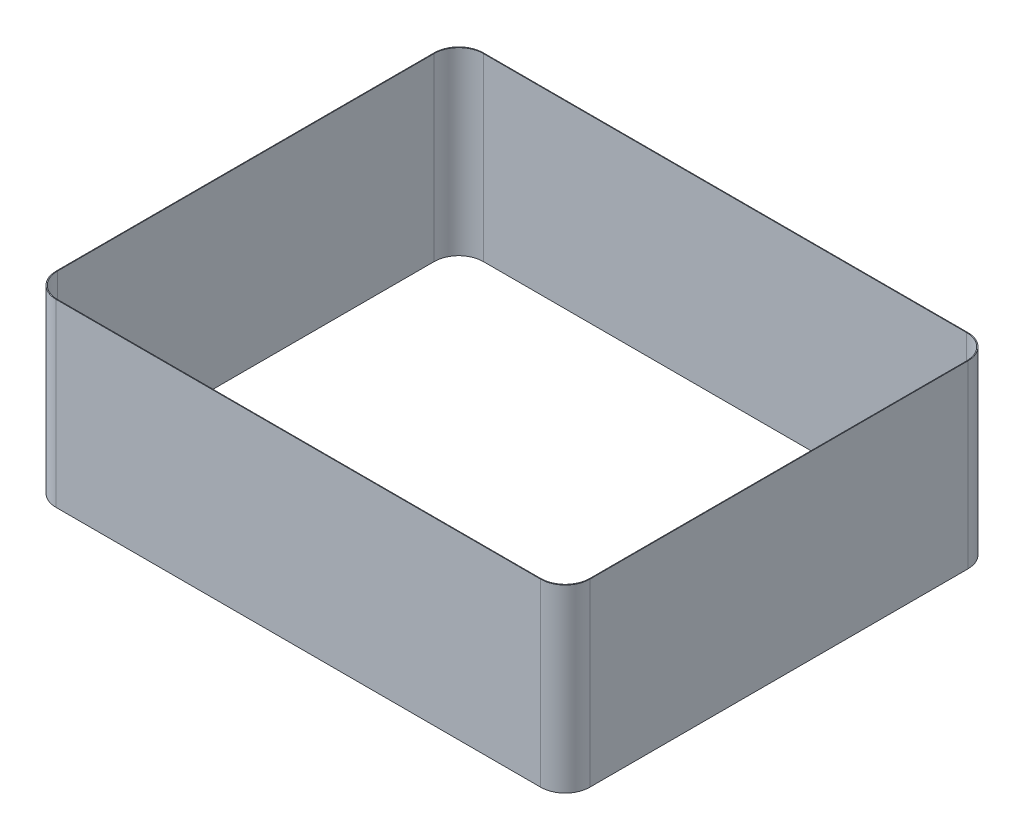
ISO-10303-21;
HEADER;
FILE_DESCRIPTION(('STEP AP214'),'2;1');
FILE_NAME('part.step','',(''),(''),'','','');
FILE_SCHEMA(('AUTOMOTIVE_DESIGN { 1 0 10303 214 1 1 1 1 }'));
ENDSEC;
DATA;
#1=APPLICATION_CONTEXT('core data for automotive mechanical design processes');
#2=APPLICATION_PROTOCOL_DEFINITION('international standard','automotive_design',2000,#1);
#3=PRODUCT_CONTEXT('',#1,'mechanical');
#4=PRODUCT('Part','Part','',(#3));
#5=PRODUCT_RELATED_PRODUCT_CATEGORY('part','',(#4));
#6=PRODUCT_DEFINITION_FORMATION('','',#4);
#7=PRODUCT_DEFINITION_CONTEXT('part definition',#1,'design');
#8=PRODUCT_DEFINITION('design','',#6,#7);
#9=PRODUCT_DEFINITION_SHAPE('','',#8);
#10=(LENGTH_UNIT() NAMED_UNIT(*) SI_UNIT(.MILLI.,.METRE.));
#11=(NAMED_UNIT(*) PLANE_ANGLE_UNIT() SI_UNIT($,.RADIAN.));
#12=(NAMED_UNIT(*) SI_UNIT($,.STERADIAN.) SOLID_ANGLE_UNIT());
#13=UNCERTAINTY_MEASURE_WITH_UNIT(LENGTH_MEASURE(1.E-05),#10,'distance_accuracy_value','');
#14=(GEOMETRIC_REPRESENTATION_CONTEXT(3) GLOBAL_UNCERTAINTY_ASSIGNED_CONTEXT((#13)) GLOBAL_UNIT_ASSIGNED_CONTEXT((#10,
#11,#12)) REPRESENTATION_CONTEXT('',''));
#15=CARTESIAN_POINT('',(0.,0.,0.));
#16=DIRECTION('',(0.,0.,1.));
#17=DIRECTION('',(1.,0.,0.));
#18=AXIS2_PLACEMENT_3D('',#15,#16,#17);
#19=CARTESIAN_POINT('',(93.9165,69.85,-73.279));
#20=DIRECTION('',(0.,-1.,0.));
#21=DIRECTION('',(0.,0.,-1.));
#22=AXIS2_PLACEMENT_3D('',#19,#20,#21);
#23=PLANE('',#22);
#24=CARTESIAN_POINT('',(93.9165,69.85,-73.279));
#25=DIRECTION('',(0.,1.,0.));
#26=DIRECTION('',(0.,0.,-1.));
#27=AXIS2_PLACEMENT_3D('',#24,#25,#26);
#28=CIRCLE('',#27,9.52500000000002);
#29=CARTESIAN_POINT('',(103.4415,69.85,-73.279));
#30=VERTEX_POINT('',#29);
#31=CARTESIAN_POINT('',(93.9165,69.85,-82.804));
#32=VERTEX_POINT('',#31);
#33=EDGE_CURVE('E210',#30,#32,#28,.T.);
#34=ORIENTED_EDGE('',*,*,#33,.T.);
#35=DIRECTION('',(-1.,0.,0.));
#36=VECTOR('',#35,1.);
#37=CARTESIAN_POINT('',(-93.9165,69.85,-82.804));
#38=LINE('',#37,#36);
#39=CARTESIAN_POINT('',(-93.9165,69.85,-82.804));
#40=VERTEX_POINT('',#39);
#41=EDGE_CURVE('E213',#32,#40,#38,.T.);
#42=ORIENTED_EDGE('',*,*,#41,.T.);
#43=CARTESIAN_POINT('',(-93.9165,69.85,-73.279));
#44=DIRECTION('',(0.,1.,0.));
#45=DIRECTION('',(0.,0.,-1.));
#46=AXIS2_PLACEMENT_3D('',#43,#44,#45);
#47=CIRCLE('',#46,9.52500000000001);
#48=CARTESIAN_POINT('',(-103.4415,69.85,-73.279));
#49=VERTEX_POINT('',#48);
#50=EDGE_CURVE('E216',#40,#49,#47,.T.);
#51=ORIENTED_EDGE('',*,*,#50,.T.);
#52=DIRECTION('',(0.,0.,1.));
#53=VECTOR('',#52,1.);
#54=CARTESIAN_POINT('',(-103.4415,69.85,73.279));
#55=LINE('',#54,#53);
#56=CARTESIAN_POINT('',(-103.4415,69.85,73.279));
#57=VERTEX_POINT('',#56);
#58=EDGE_CURVE('E218',#49,#57,#55,.T.);
#59=ORIENTED_EDGE('',*,*,#58,.T.);
#60=CARTESIAN_POINT('',(-93.9165,69.85,73.279));
#61=DIRECTION('',(0.,1.,0.));
#62=DIRECTION('',(0.,0.,-1.));
#63=AXIS2_PLACEMENT_3D('',#60,#61,#62);
#64=CIRCLE('',#63,9.52500000000001);
#65=CARTESIAN_POINT('',(-93.9165,69.85,82.804));
#66=VERTEX_POINT('',#65);
#67=EDGE_CURVE('E220',#57,#66,#64,.T.);
#68=ORIENTED_EDGE('',*,*,#67,.T.);
#69=DIRECTION('',(1.,0.,0.));
#70=VECTOR('',#69,1.);
#71=CARTESIAN_POINT('',(-93.9165,69.85,82.804));
#72=LINE('',#71,#70);
#73=CARTESIAN_POINT('',(93.9165,69.85,82.804));
#74=VERTEX_POINT('',#73);
#75=EDGE_CURVE('E222',#66,#74,#72,.T.);
#76=ORIENTED_EDGE('',*,*,#75,.T.);
#77=CARTESIAN_POINT('',(93.9165,69.85,73.279));
#78=DIRECTION('',(0.,1.,0.));
#79=DIRECTION('',(0.,0.,1.));
#80=AXIS2_PLACEMENT_3D('',#77,#78,#79);
#81=CIRCLE('',#80,9.52500000000001);
#82=CARTESIAN_POINT('',(103.4415,69.85,73.279));
#83=VERTEX_POINT('',#82);
#84=EDGE_CURVE('E224',#74,#83,#81,.T.);
#85=ORIENTED_EDGE('',*,*,#84,.T.);
#86=DIRECTION('',(0.,0.,-1.));
#87=VECTOR('',#86,1.);
#88=CARTESIAN_POINT('',(103.4415,69.85,73.279));
#89=LINE('',#88,#87);
#90=EDGE_CURVE('E226',#83,#30,#89,.T.);
#91=ORIENTED_EDGE('',*,*,#90,.T.);
#92=EDGE_LOOP('',(#34,#42,#51,#59,#68,#76,#85,#91));
#93=FACE_BOUND('',#92,.T.);
#94=CARTESIAN_POINT('',(93.6625,69.85,-73.025));
#95=DIRECTION('',(0.,1.,0.));
#96=DIRECTION('',(0.,0.,-1.));
#97=AXIS2_PLACEMENT_3D('',#94,#95,#96);
#98=CIRCLE('',#97,9.52500000000002);
#99=CARTESIAN_POINT('',(103.1875,69.85,-73.025));
#100=VERTEX_POINT('',#99);
#101=CARTESIAN_POINT('',(93.6625,69.85,-82.55));
#102=VERTEX_POINT('',#101);
#103=EDGE_CURVE('E145',#100,#102,#98,.T.);
#104=ORIENTED_EDGE('',*,*,#103,.F.);
#105=DIRECTION('',(0.,0.,-1.));
#106=VECTOR('',#105,1.);
#107=CARTESIAN_POINT('',(103.1875,69.85,73.025));
#108=LINE('',#107,#106);
#109=CARTESIAN_POINT('',(103.1875,69.85,73.025));
#110=VERTEX_POINT('',#109);
#111=EDGE_CURVE('E178',#110,#100,#108,.T.);
#112=ORIENTED_EDGE('',*,*,#111,.F.);
#113=CARTESIAN_POINT('',(93.6625,69.85,73.025));
#114=DIRECTION('',(0.,1.,0.));
#115=DIRECTION('',(0.,0.,1.));
#116=AXIS2_PLACEMENT_3D('',#113,#114,#115);
#117=CIRCLE('',#116,9.52500000000002);
#118=CARTESIAN_POINT('',(93.6625,69.85,82.55));
#119=VERTEX_POINT('',#118);
#120=EDGE_CURVE('E176',#119,#110,#117,.T.);
#121=ORIENTED_EDGE('',*,*,#120,.F.);
#122=DIRECTION('',(1.,0.,0.));
#123=VECTOR('',#122,1.);
#124=CARTESIAN_POINT('',(-93.6624999999999,69.85,82.55));
#125=LINE('',#124,#123);
#126=CARTESIAN_POINT('',(-93.6624999999999,69.85,82.55));
#127=VERTEX_POINT('',#126);
#128=EDGE_CURVE('E174',#127,#119,#125,.T.);
#129=ORIENTED_EDGE('',*,*,#128,.F.);
#130=CARTESIAN_POINT('',(-93.6624999999999,69.85,73.025));
#131=DIRECTION('',(0.,1.,0.));
#132=DIRECTION('',(0.,0.,-1.));
#133=AXIS2_PLACEMENT_3D('',#130,#131,#132);
#134=CIRCLE('',#133,9.52500000000001);
#135=CARTESIAN_POINT('',(-103.1875,69.85,73.025));
#136=VERTEX_POINT('',#135);
#137=EDGE_CURVE('E172',#136,#127,#134,.T.);
#138=ORIENTED_EDGE('',*,*,#137,.F.);
#139=DIRECTION('',(0.,0.,1.));
#140=VECTOR('',#139,1.);
#141=CARTESIAN_POINT('',(-103.1875,69.85,73.025));
#142=LINE('',#141,#140);
#143=CARTESIAN_POINT('',(-103.1875,69.85,-73.025));
#144=VERTEX_POINT('',#143);
#145=EDGE_CURVE('E168',#144,#136,#142,.T.);
#146=ORIENTED_EDGE('',*,*,#145,.F.);
#147=CARTESIAN_POINT('',(-93.6624999999999,69.85,-73.025));
#148=DIRECTION('',(0.,1.,0.));
#149=DIRECTION('',(0.,0.,-1.));
#150=AXIS2_PLACEMENT_3D('',#147,#148,#149);
#151=CIRCLE('',#150,9.52500000000001);
#152=CARTESIAN_POINT('',(-93.6624999999999,69.85,-82.55));
#153=VERTEX_POINT('',#152);
#154=EDGE_CURVE('E166',#153,#144,#151,.T.);
#155=ORIENTED_EDGE('',*,*,#154,.F.);
#156=DIRECTION('',(-1.,0.,0.));
#157=VECTOR('',#156,1.);
#158=CARTESIAN_POINT('',(-93.6624999999999,69.85,-82.55));
#159=LINE('',#158,#157);
#160=EDGE_CURVE('E153',#102,#153,#159,.T.);
#161=ORIENTED_EDGE('',*,*,#160,.F.);
#162=EDGE_LOOP('',(#104,#112,#121,#129,#138,#146,#155,#161));
#163=FACE_BOUND('',#162,.T.);
#164=ADVANCED_FACE('F32',(#93,#163),#23,.F.);
#165=CARTESIAN_POINT('',(93.9165,0.,-73.279));
#166=DIRECTION('',(0.,-1.,0.));
#167=DIRECTION('',(0.,0.,-1.));
#168=AXIS2_PLACEMENT_3D('',#165,#166,#167);
#169=PLANE('',#168);
#170=CARTESIAN_POINT('',(93.9165,0.,-73.279));
#171=DIRECTION('',(0.,1.,0.));
#172=DIRECTION('',(0.,0.,-1.));
#173=AXIS2_PLACEMENT_3D('',#170,#171,#172);
#174=CIRCLE('',#173,9.52500000000002);
#175=CARTESIAN_POINT('',(103.4415,0.,-73.279));
#176=VERTEX_POINT('',#175);
#177=CARTESIAN_POINT('',(93.9165,0.,-82.804));
#178=VERTEX_POINT('',#177);
#179=EDGE_CURVE('E161',#176,#178,#174,.T.);
#180=ORIENTED_EDGE('',*,*,#179,.F.);
#181=DIRECTION('',(0.,0.,-1.));
#182=VECTOR('',#181,1.);
#183=CARTESIAN_POINT('',(103.4415,0.,73.279));
#184=LINE('',#183,#182);
#185=CARTESIAN_POINT('',(103.4415,0.,73.279));
#186=VERTEX_POINT('',#185);
#187=EDGE_CURVE('E214',#186,#176,#184,.T.);
#188=ORIENTED_EDGE('',*,*,#187,.F.);
#189=CARTESIAN_POINT('',(93.9165,0.,73.279));
#190=DIRECTION('',(0.,1.,0.));
#191=DIRECTION('',(0.,0.,1.));
#192=AXIS2_PLACEMENT_3D('',#189,#190,#191);
#193=CIRCLE('',#192,9.52500000000001);
#194=CARTESIAN_POINT('',(93.9165,0.,82.804));
#195=VERTEX_POINT('',#194);
#196=EDGE_CURVE('E241',#195,#186,#193,.T.);
#197=ORIENTED_EDGE('',*,*,#196,.F.);
#198=DIRECTION('',(1.,0.,0.));
#199=VECTOR('',#198,1.);
#200=CARTESIAN_POINT('',(-93.9165,0.,82.804));
#201=LINE('',#200,#199);
#202=CARTESIAN_POINT('',(-93.9165,0.,82.804));
#203=VERTEX_POINT('',#202);
#204=EDGE_CURVE('E239',#203,#195,#201,.T.);
#205=ORIENTED_EDGE('',*,*,#204,.F.);
#206=CARTESIAN_POINT('',(-93.9165,0.,73.279));
#207=DIRECTION('',(0.,1.,0.));
#208=DIRECTION('',(0.,0.,-1.));
#209=AXIS2_PLACEMENT_3D('',#206,#207,#208);
#210=CIRCLE('',#209,9.52500000000001);
#211=CARTESIAN_POINT('',(-103.4415,0.,73.279));
#212=VERTEX_POINT('',#211);
#213=EDGE_CURVE('E237',#212,#203,#210,.T.);
#214=ORIENTED_EDGE('',*,*,#213,.F.);
#215=DIRECTION('',(0.,0.,1.));
#216=VECTOR('',#215,1.);
#217=CARTESIAN_POINT('',(-103.4415,0.,73.279));
#218=LINE('',#217,#216);
#219=CARTESIAN_POINT('',(-103.4415,0.,-73.279));
#220=VERTEX_POINT('',#219);
#221=EDGE_CURVE('E235',#220,#212,#218,.T.);
#222=ORIENTED_EDGE('',*,*,#221,.F.);
#223=CARTESIAN_POINT('',(-93.9165,0.,-73.279));
#224=DIRECTION('',(0.,1.,0.));
#225=DIRECTION('',(0.,0.,-1.));
#226=AXIS2_PLACEMENT_3D('',#223,#224,#225);
#227=CIRCLE('',#226,9.52500000000001);
#228=CARTESIAN_POINT('',(-93.9165,0.,-82.804));
#229=VERTEX_POINT('',#228);
#230=EDGE_CURVE('E233',#229,#220,#227,.T.);
#231=ORIENTED_EDGE('',*,*,#230,.F.);
#232=DIRECTION('',(-1.,0.,0.));
#233=VECTOR('',#232,1.);
#234=CARTESIAN_POINT('',(-93.9165,0.,-82.804));
#235=LINE('',#234,#233);
#236=EDGE_CURVE('E231',#178,#229,#235,.T.);
#237=ORIENTED_EDGE('',*,*,#236,.F.);
#238=EDGE_LOOP('',(#180,#188,#197,#205,#214,#222,#231,#237));
#239=FACE_BOUND('',#238,.T.);
#240=DIRECTION('',(0.,0.,-1.));
#241=VECTOR('',#240,1.);
#242=CARTESIAN_POINT('',(103.1875,0.,73.025));
#243=LINE('',#242,#241);
#244=CARTESIAN_POINT('',(103.1875,0.,73.025));
#245=VERTEX_POINT('',#244);
#246=CARTESIAN_POINT('',(103.1875,0.,-73.025));
#247=VERTEX_POINT('',#246);
#248=EDGE_CURVE('E154',#245,#247,#243,.T.);
#249=ORIENTED_EDGE('',*,*,#248,.T.);
#250=CARTESIAN_POINT('',(93.6625,0.,-73.025));
#251=DIRECTION('',(0.,1.,0.));
#252=DIRECTION('',(0.,0.,-1.));
#253=AXIS2_PLACEMENT_3D('',#250,#251,#252);
#254=CIRCLE('',#253,9.52500000000002);
#255=CARTESIAN_POINT('',(93.6625,0.,-82.55));
#256=VERTEX_POINT('',#255);
#257=EDGE_CURVE('E55',#247,#256,#254,.T.);
#258=ORIENTED_EDGE('',*,*,#257,.T.);
#259=DIRECTION('',(-1.,0.,0.));
#260=VECTOR('',#259,1.);
#261=CARTESIAN_POINT('',(-93.6624999999999,0.,-82.55));
#262=LINE('',#261,#260);
#263=CARTESIAN_POINT('',(-93.6624999999999,0.,-82.55));
#264=VERTEX_POINT('',#263);
#265=EDGE_CURVE('E160',#256,#264,#262,.T.);
#266=ORIENTED_EDGE('',*,*,#265,.T.);
#267=CARTESIAN_POINT('',(-93.6624999999999,0.,-73.025));
#268=DIRECTION('',(0.,1.,0.));
#269=DIRECTION('',(0.,0.,-1.));
#270=AXIS2_PLACEMENT_3D('',#267,#268,#269);
#271=CIRCLE('',#270,9.52500000000001);
#272=CARTESIAN_POINT('',(-103.1875,0.,-73.025));
#273=VERTEX_POINT('',#272);
#274=EDGE_CURVE('E182',#264,#273,#271,.T.);
#275=ORIENTED_EDGE('',*,*,#274,.T.);
#276=DIRECTION('',(0.,0.,1.));
#277=VECTOR('',#276,1.);
#278=CARTESIAN_POINT('',(-103.1875,0.,73.025));
#279=LINE('',#278,#277);
#280=CARTESIAN_POINT('',(-103.1875,0.,73.025));
#281=VERTEX_POINT('',#280);
#282=EDGE_CURVE('E185',#273,#281,#279,.T.);
#283=ORIENTED_EDGE('',*,*,#282,.T.);
#284=CARTESIAN_POINT('',(-93.6624999999999,0.,73.025));
#285=DIRECTION('',(0.,1.,0.));
#286=DIRECTION('',(0.,0.,-1.));
#287=AXIS2_PLACEMENT_3D('',#284,#285,#286);
#288=CIRCLE('',#287,9.52500000000001);
#289=CARTESIAN_POINT('',(-93.6624999999999,0.,82.55));
#290=VERTEX_POINT('',#289);
#291=EDGE_CURVE('E188',#281,#290,#288,.T.);
#292=ORIENTED_EDGE('',*,*,#291,.T.);
#293=DIRECTION('',(1.,0.,0.));
#294=VECTOR('',#293,1.);
#295=CARTESIAN_POINT('',(-93.6624999999999,0.,82.55));
#296=LINE('',#295,#294);
#297=CARTESIAN_POINT('',(93.6625,0.,82.55));
#298=VERTEX_POINT('',#297);
#299=EDGE_CURVE('E191',#290,#298,#296,.T.);
#300=ORIENTED_EDGE('',*,*,#299,.T.);
#301=CARTESIAN_POINT('',(93.6625,0.,73.025));
#302=DIRECTION('',(0.,1.,0.));
#303=DIRECTION('',(0.,0.,1.));
#304=AXIS2_PLACEMENT_3D('',#301,#302,#303);
#305=CIRCLE('',#304,9.52500000000002);
#306=EDGE_CURVE('E194',#298,#245,#305,.T.);
#307=ORIENTED_EDGE('',*,*,#306,.T.);
#308=EDGE_LOOP('',(#249,#258,#266,#275,#283,#292,#300,#307));
#309=FACE_BOUND('',#308,.T.);
#310=ADVANCED_FACE('F271',(#239,#309),#169,.T.);
#311=CARTESIAN_POINT('',(93.9165,69.85,-73.279));
#312=DIRECTION('',(0.,-1.,0.));
#313=DIRECTION('',(0.,0.,-1.));
#314=AXIS2_PLACEMENT_3D('',#311,#312,#313);
#315=CYLINDRICAL_SURFACE('',#314,9.52500000000002);
#316=ORIENTED_EDGE('',*,*,#179,.T.);
#317=DIRECTION('',(0.,-1.,0.));
#318=VECTOR('',#317,1.);
#319=CARTESIAN_POINT('',(93.9165,69.85,-82.804));
#320=LINE('',#319,#318);
#321=EDGE_CURVE('E11',#32,#178,#320,.T.);
#322=ORIENTED_EDGE('',*,*,#321,.F.);
#323=ORIENTED_EDGE('',*,*,#33,.F.);
#324=DIRECTION('',(0.,-1.,0.));
#325=VECTOR('',#324,1.);
#326=CARTESIAN_POINT('',(103.4415,69.85,-73.279));
#327=LINE('',#326,#325);
#328=EDGE_CURVE('E228',#30,#176,#327,.T.);
#329=ORIENTED_EDGE('',*,*,#328,.T.);
#330=EDGE_LOOP('',(#316,#322,#323,#329));
#331=FACE_BOUND('',#330,.T.);
#332=ADVANCED_FACE('F34',(#331),#315,.T.);
#333=CARTESIAN_POINT('',(-93.9165,69.85,-82.804));
#334=DIRECTION('',(0.,0.,1.));
#335=DIRECTION('',(1.,0.,0.));
#336=AXIS2_PLACEMENT_3D('',#333,#334,#335);
#337=PLANE('',#336);
#338=ORIENTED_EDGE('',*,*,#236,.T.);
#339=DIRECTION('',(0.,-1.,0.));
#340=VECTOR('',#339,1.);
#341=CARTESIAN_POINT('',(-93.9165,69.85,-82.804));
#342=LINE('',#341,#340);
#343=EDGE_CURVE('E40',#40,#229,#342,.T.);
#344=ORIENTED_EDGE('',*,*,#343,.F.);
#345=ORIENTED_EDGE('',*,*,#41,.F.);
#346=ORIENTED_EDGE('',*,*,#321,.T.);
#347=EDGE_LOOP('',(#338,#344,#345,#346));
#348=FACE_BOUND('',#347,.T.);
#349=ADVANCED_FACE('F288',(#348),#337,.F.);
#350=CARTESIAN_POINT('',(-93.9165,69.85,-73.279));
#351=DIRECTION('',(0.,-1.,0.));
#352=DIRECTION('',(0.,0.,-1.));
#353=AXIS2_PLACEMENT_3D('',#350,#351,#352);
#354=CYLINDRICAL_SURFACE('',#353,9.52500000000001);
#355=ORIENTED_EDGE('',*,*,#230,.T.);
#356=DIRECTION('',(0.,-1.,0.));
#357=VECTOR('',#356,1.);
#358=CARTESIAN_POINT('',(-103.4415,69.85,-73.279));
#359=LINE('',#358,#357);
#360=EDGE_CURVE('E258',#49,#220,#359,.T.);
#361=ORIENTED_EDGE('',*,*,#360,.F.);
#362=ORIENTED_EDGE('',*,*,#50,.F.);
#363=ORIENTED_EDGE('',*,*,#343,.T.);
#364=EDGE_LOOP('',(#355,#361,#362,#363));
#365=FACE_BOUND('',#364,.T.);
#366=ADVANCED_FACE('F265',(#365),#354,.T.);
#367=CARTESIAN_POINT('',(-103.4415,69.85,73.279));
#368=DIRECTION('',(1.,0.,0.));
#369=DIRECTION('',(0.,0.,-1.));
#370=AXIS2_PLACEMENT_3D('',#367,#368,#369);
#371=PLANE('',#370);
#372=ORIENTED_EDGE('',*,*,#221,.T.);
#373=DIRECTION('',(0.,-1.,0.));
#374=VECTOR('',#373,1.);
#375=CARTESIAN_POINT('',(-103.4415,69.85,73.279));
#376=LINE('',#375,#374);
#377=EDGE_CURVE('E255',#57,#212,#376,.T.);
#378=ORIENTED_EDGE('',*,*,#377,.F.);
#379=ORIENTED_EDGE('',*,*,#58,.F.);
#380=ORIENTED_EDGE('',*,*,#360,.T.);
#381=EDGE_LOOP('',(#372,#378,#379,#380));
#382=FACE_BOUND('',#381,.T.);
#383=ADVANCED_FACE('F277',(#382),#371,.F.);
#384=CARTESIAN_POINT('',(-93.9165,69.85,73.279));
#385=DIRECTION('',(0.,-1.,0.));
#386=DIRECTION('',(0.,0.,-1.));
#387=AXIS2_PLACEMENT_3D('',#384,#385,#386);
#388=CYLINDRICAL_SURFACE('',#387,9.52500000000001);
#389=ORIENTED_EDGE('',*,*,#213,.T.);
#390=DIRECTION('',(0.,-1.,0.));
#391=VECTOR('',#390,1.);
#392=CARTESIAN_POINT('',(-93.9165,69.85,82.804));
#393=LINE('',#392,#391);
#394=EDGE_CURVE('E252',#66,#203,#393,.T.);
#395=ORIENTED_EDGE('',*,*,#394,.F.);
#396=ORIENTED_EDGE('',*,*,#67,.F.);
#397=ORIENTED_EDGE('',*,*,#377,.T.);
#398=EDGE_LOOP('',(#389,#395,#396,#397));
#399=FACE_BOUND('',#398,.T.);
#400=ADVANCED_FACE('F281',(#399),#388,.T.);
#401=CARTESIAN_POINT('',(-93.9165,69.85,82.804));
#402=DIRECTION('',(0.,0.,-1.));
#403=DIRECTION('',(-1.,0.,0.));
#404=AXIS2_PLACEMENT_3D('',#401,#402,#403);
#405=PLANE('',#404);
#406=ORIENTED_EDGE('',*,*,#204,.T.);
#407=DIRECTION('',(0.,-1.,0.));
#408=VECTOR('',#407,1.);
#409=CARTESIAN_POINT('',(93.9165,69.85,82.804));
#410=LINE('',#409,#408);
#411=EDGE_CURVE('E249',#74,#195,#410,.T.);
#412=ORIENTED_EDGE('',*,*,#411,.F.);
#413=ORIENTED_EDGE('',*,*,#75,.F.);
#414=ORIENTED_EDGE('',*,*,#394,.T.);
#415=EDGE_LOOP('',(#406,#412,#413,#414));
#416=FACE_BOUND('',#415,.T.);
#417=ADVANCED_FACE('F301',(#416),#405,.F.);
#418=CARTESIAN_POINT('',(93.9165,69.85,73.279));
#419=DIRECTION('',(0.,-1.,0.));
#420=DIRECTION('',(0.,0.,-1.));
#421=AXIS2_PLACEMENT_3D('',#418,#419,#420);
#422=CYLINDRICAL_SURFACE('',#421,9.52500000000001);
#423=ORIENTED_EDGE('',*,*,#196,.T.);
#424=DIRECTION('',(0.,-1.,0.));
#425=VECTOR('',#424,1.);
#426=CARTESIAN_POINT('',(103.4415,69.85,73.279));
#427=LINE('',#426,#425);
#428=EDGE_CURVE('E246',#83,#186,#427,.T.);
#429=ORIENTED_EDGE('',*,*,#428,.F.);
#430=ORIENTED_EDGE('',*,*,#84,.F.);
#431=ORIENTED_EDGE('',*,*,#411,.T.);
#432=EDGE_LOOP('',(#423,#429,#430,#431));
#433=FACE_BOUND('',#432,.T.);
#434=ADVANCED_FACE('F299',(#433),#422,.T.);
#435=CARTESIAN_POINT('',(103.4415,69.85,73.279));
#436=DIRECTION('',(-1.,0.,0.));
#437=DIRECTION('',(0.,0.,1.));
#438=AXIS2_PLACEMENT_3D('',#435,#436,#437);
#439=PLANE('',#438);
#440=ORIENTED_EDGE('',*,*,#187,.T.);
#441=ORIENTED_EDGE('',*,*,#328,.F.);
#442=ORIENTED_EDGE('',*,*,#90,.F.);
#443=ORIENTED_EDGE('',*,*,#428,.T.);
#444=EDGE_LOOP('',(#440,#441,#442,#443));
#445=FACE_BOUND('',#444,.T.);
#446=ADVANCED_FACE('F294',(#445),#439,.F.);
#447=CARTESIAN_POINT('',(93.6625,69.85,-73.025));
#448=DIRECTION('',(0.,-1.,0.));
#449=DIRECTION('',(0.,0.,-1.));
#450=AXIS2_PLACEMENT_3D('',#447,#448,#449);
#451=CYLINDRICAL_SURFACE('',#450,9.52500000000002);
#452=ORIENTED_EDGE('',*,*,#257,.F.);
#453=DIRECTION('',(0.,-1.,0.));
#454=VECTOR('',#453,1.);
#455=CARTESIAN_POINT('',(103.1875,69.85,-73.025));
#456=LINE('',#455,#454);
#457=EDGE_CURVE('E149',#100,#247,#456,.T.);
#458=ORIENTED_EDGE('',*,*,#457,.F.);
#459=ORIENTED_EDGE('',*,*,#103,.T.);
#460=DIRECTION('',(0.,-1.,0.));
#461=VECTOR('',#460,1.);
#462=CARTESIAN_POINT('',(93.6625,69.85,-82.55));
#463=LINE('',#462,#461);
#464=EDGE_CURVE('E148',#102,#256,#463,.T.);
#465=ORIENTED_EDGE('',*,*,#464,.T.);
#466=EDGE_LOOP('',(#452,#458,#459,#465));
#467=FACE_BOUND('',#466,.T.);
#468=ADVANCED_FACE('F147',(#467),#451,.F.);
#469=CARTESIAN_POINT('',(-93.6624999999999,69.85,-82.55));
#470=DIRECTION('',(0.,0.,1.));
#471=DIRECTION('',(1.,0.,0.));
#472=AXIS2_PLACEMENT_3D('',#469,#470,#471);
#473=PLANE('',#472);
#474=ORIENTED_EDGE('',*,*,#265,.F.);
#475=ORIENTED_EDGE('',*,*,#464,.F.);
#476=ORIENTED_EDGE('',*,*,#160,.T.);
#477=DIRECTION('',(0.,-1.,0.));
#478=VECTOR('',#477,1.);
#479=CARTESIAN_POINT('',(-93.6624999999999,69.85,-82.55));
#480=LINE('',#479,#478);
#481=EDGE_CURVE('E162',#153,#264,#480,.T.);
#482=ORIENTED_EDGE('',*,*,#481,.T.);
#483=EDGE_LOOP('',(#474,#475,#476,#482));
#484=FACE_BOUND('',#483,.T.);
#485=ADVANCED_FACE('F157',(#484),#473,.T.);
#486=CARTESIAN_POINT('',(-93.6624999999999,69.85,-73.025));
#487=DIRECTION('',(0.,-1.,0.));
#488=DIRECTION('',(0.,0.,-1.));
#489=AXIS2_PLACEMENT_3D('',#486,#487,#488);
#490=CYLINDRICAL_SURFACE('',#489,9.52500000000001);
#491=ORIENTED_EDGE('',*,*,#274,.F.);
#492=ORIENTED_EDGE('',*,*,#481,.F.);
#493=ORIENTED_EDGE('',*,*,#154,.T.);
#494=DIRECTION('',(0.,-1.,0.));
#495=VECTOR('',#494,1.);
#496=CARTESIAN_POINT('',(-103.1875,69.85,-73.025));
#497=LINE('',#496,#495);
#498=EDGE_CURVE('E207',#144,#273,#497,.T.);
#499=ORIENTED_EDGE('',*,*,#498,.T.);
#500=EDGE_LOOP('',(#491,#492,#493,#499));
#501=FACE_BOUND('',#500,.T.);
#502=ADVANCED_FACE('F326',(#501),#490,.F.);
#503=CARTESIAN_POINT('',(-103.1875,69.85,73.025));
#504=DIRECTION('',(1.,0.,0.));
#505=DIRECTION('',(0.,0.,-1.));
#506=AXIS2_PLACEMENT_3D('',#503,#504,#505);
#507=PLANE('',#506);
#508=ORIENTED_EDGE('',*,*,#282,.F.);
#509=ORIENTED_EDGE('',*,*,#498,.F.);
#510=ORIENTED_EDGE('',*,*,#145,.T.);
#511=DIRECTION('',(0.,-1.,0.));
#512=VECTOR('',#511,1.);
#513=CARTESIAN_POINT('',(-103.1875,69.85,73.025));
#514=LINE('',#513,#512);
#515=EDGE_CURVE('E205',#136,#281,#514,.T.);
#516=ORIENTED_EDGE('',*,*,#515,.T.);
#517=EDGE_LOOP('',(#508,#509,#510,#516));
#518=FACE_BOUND('',#517,.T.);
#519=ADVANCED_FACE('F330',(#518),#507,.T.);
#520=CARTESIAN_POINT('',(-93.6624999999999,69.85,73.025));
#521=DIRECTION('',(0.,-1.,0.));
#522=DIRECTION('',(0.,0.,-1.));
#523=AXIS2_PLACEMENT_3D('',#520,#521,#522);
#524=CYLINDRICAL_SURFACE('',#523,9.52500000000001);
#525=ORIENTED_EDGE('',*,*,#291,.F.);
#526=ORIENTED_EDGE('',*,*,#515,.F.);
#527=ORIENTED_EDGE('',*,*,#137,.T.);
#528=DIRECTION('',(0.,-1.,0.));
#529=VECTOR('',#528,1.);
#530=CARTESIAN_POINT('',(-93.6624999999999,69.85,82.55));
#531=LINE('',#530,#529);
#532=EDGE_CURVE('E203',#127,#290,#531,.T.);
#533=ORIENTED_EDGE('',*,*,#532,.T.);
#534=EDGE_LOOP('',(#525,#526,#527,#533));
#535=FACE_BOUND('',#534,.T.);
#536=ADVANCED_FACE('F336',(#535),#524,.F.);
#537=CARTESIAN_POINT('',(-93.6624999999999,69.85,82.55));
#538=DIRECTION('',(0.,0.,-1.));
#539=DIRECTION('',(-1.,0.,0.));
#540=AXIS2_PLACEMENT_3D('',#537,#538,#539);
#541=PLANE('',#540);
#542=ORIENTED_EDGE('',*,*,#299,.F.);
#543=ORIENTED_EDGE('',*,*,#532,.F.);
#544=ORIENTED_EDGE('',*,*,#128,.T.);
#545=DIRECTION('',(0.,-1.,0.));
#546=VECTOR('',#545,1.);
#547=CARTESIAN_POINT('',(93.6625,69.85,82.55));
#548=LINE('',#547,#546);
#549=EDGE_CURVE('E201',#119,#298,#548,.T.);
#550=ORIENTED_EDGE('',*,*,#549,.T.);
#551=EDGE_LOOP('',(#542,#543,#544,#550));
#552=FACE_BOUND('',#551,.T.);
#553=ADVANCED_FACE('F340',(#552),#541,.T.);
#554=CARTESIAN_POINT('',(93.6625,69.85,73.025));
#555=DIRECTION('',(0.,-1.,0.));
#556=DIRECTION('',(0.,0.,-1.));
#557=AXIS2_PLACEMENT_3D('',#554,#555,#556);
#558=CYLINDRICAL_SURFACE('',#557,9.52500000000002);
#559=ORIENTED_EDGE('',*,*,#306,.F.);
#560=ORIENTED_EDGE('',*,*,#549,.F.);
#561=ORIENTED_EDGE('',*,*,#120,.T.);
#562=DIRECTION('',(0.,-1.,0.));
#563=VECTOR('',#562,1.);
#564=CARTESIAN_POINT('',(103.1875,69.85,73.025));
#565=LINE('',#564,#563);
#566=EDGE_CURVE('E47',#110,#245,#565,.T.);
#567=ORIENTED_EDGE('',*,*,#566,.T.);
#568=EDGE_LOOP('',(#559,#560,#561,#567));
#569=FACE_BOUND('',#568,.T.);
#570=ADVANCED_FACE('F344',(#569),#558,.F.);
#571=CARTESIAN_POINT('',(103.1875,69.85,73.025));
#572=DIRECTION('',(-1.,0.,0.));
#573=DIRECTION('',(0.,0.,1.));
#574=AXIS2_PLACEMENT_3D('',#571,#572,#573);
#575=PLANE('',#574);
#576=ORIENTED_EDGE('',*,*,#248,.F.);
#577=ORIENTED_EDGE('',*,*,#566,.F.);
#578=ORIENTED_EDGE('',*,*,#111,.T.);
#579=ORIENTED_EDGE('',*,*,#457,.T.);
#580=EDGE_LOOP('',(#576,#577,#578,#579));
#581=FACE_BOUND('',#580,.T.);
#582=ADVANCED_FACE('F348',(#581),#575,.T.);
#583=CLOSED_SHELL('',(#164,#310,#332,#349,#366,#383,#400,#417,#434,#446,#468,#485,#502,#519,
#536,#553,#570,#582));
#584=MANIFOLD_SOLID_BREP('B2',#583);
#585=ADVANCED_BREP_SHAPE_REPRESENTATION('',(#18,#584),#14);
#586=SHAPE_DEFINITION_REPRESENTATION(#9,#585);
ENDSEC;
END-ISO-10303-21;
